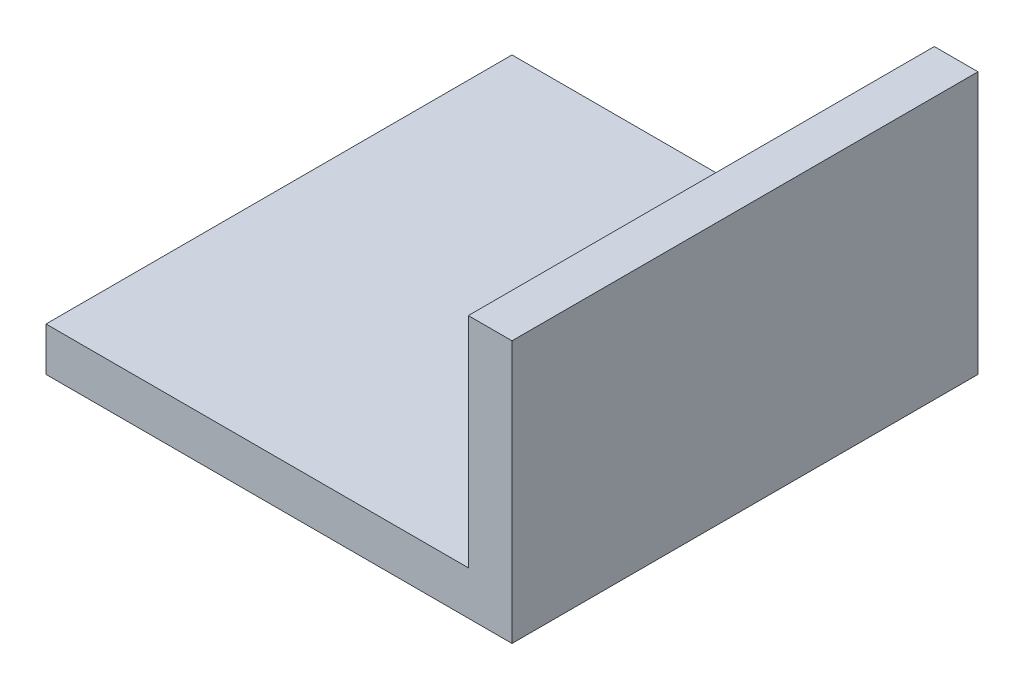
ISO-10303-21;
HEADER;
FILE_DESCRIPTION(('STEP AP214'),'2;1');
FILE_NAME('part.step','',(''),(''),'','','');
FILE_SCHEMA(('AUTOMOTIVE_DESIGN { 1 0 10303 214 1 1 1 1 }'));
ENDSEC;
DATA;
#1=APPLICATION_CONTEXT('core data for automotive mechanical design processes');
#2=APPLICATION_PROTOCOL_DEFINITION('international standard','automotive_design',2000,#1);
#3=PRODUCT_CONTEXT('',#1,'mechanical');
#4=PRODUCT('Part','Part','',(#3));
#5=PRODUCT_RELATED_PRODUCT_CATEGORY('part','',(#4));
#6=PRODUCT_DEFINITION_FORMATION('','',#4);
#7=PRODUCT_DEFINITION_CONTEXT('part definition',#1,'design');
#8=PRODUCT_DEFINITION('design','',#6,#7);
#9=PRODUCT_DEFINITION_SHAPE('','',#8);
#10=(LENGTH_UNIT() NAMED_UNIT(*) SI_UNIT(.MILLI.,.METRE.));
#11=(NAMED_UNIT(*) PLANE_ANGLE_UNIT() SI_UNIT($,.RADIAN.));
#12=(NAMED_UNIT(*) SI_UNIT($,.STERADIAN.) SOLID_ANGLE_UNIT());
#13=UNCERTAINTY_MEASURE_WITH_UNIT(LENGTH_MEASURE(1.E-05),#10,'distance_accuracy_value','');
#14=(GEOMETRIC_REPRESENTATION_CONTEXT(3) GLOBAL_UNCERTAINTY_ASSIGNED_CONTEXT((#13)) GLOBAL_UNIT_ASSIGNED_CONTEXT((#10,
#11,#12)) REPRESENTATION_CONTEXT('',''));
#15=CARTESIAN_POINT('',(0.,0.,0.));
#16=DIRECTION('',(0.,0.,1.));
#17=DIRECTION('',(1.,0.,0.));
#18=AXIS2_PLACEMENT_3D('',#15,#16,#17);
#19=CARTESIAN_POINT('',(-70.953543524342,7.11516939529826,50.8));
#20=DIRECTION('',(1.,0.,0.));
#21=DIRECTION('',(0.,0.,-1.));
#22=AXIS2_PLACEMENT_3D('',#19,#20,#21);
#23=PLANE('',#22);
#24=DIRECTION('',(0.,-1.,0.));
#25=VECTOR('',#24,1.);
#26=CARTESIAN_POINT('',(-70.953543524342,7.11516939529826,0.));
#27=LINE('',#26,#25);
#28=CARTESIAN_POINT('',(-70.953543524342,7.11516939529826,0.));
#29=VERTEX_POINT('',#28);
#30=CARTESIAN_POINT('',(-70.953543524342,2.35266939529827,0.));
#31=VERTEX_POINT('',#30);
#32=EDGE_CURVE('E127',#29,#31,#27,.T.);
#33=ORIENTED_EDGE('',*,*,#32,.T.);
#34=DIRECTION('',(0.,0.,-1.));
#35=VECTOR('',#34,1.);
#36=CARTESIAN_POINT('',(-70.953543524342,2.35266939529827,50.8));
#37=LINE('',#36,#35);
#38=CARTESIAN_POINT('',(-70.953543524342,2.35266939529827,50.8));
#39=VERTEX_POINT('',#38);
#40=EDGE_CURVE('E11',#39,#31,#37,.T.);
#41=ORIENTED_EDGE('',*,*,#40,.F.);
#42=DIRECTION('',(0.,-1.,0.));
#43=VECTOR('',#42,1.);
#44=CARTESIAN_POINT('',(-70.953543524342,7.11516939529826,50.8));
#45=LINE('',#44,#43);
#46=CARTESIAN_POINT('',(-70.953543524342,7.11516939529826,50.8));
#47=VERTEX_POINT('',#46);
#48=EDGE_CURVE('E137',#47,#39,#45,.T.);
#49=ORIENTED_EDGE('',*,*,#48,.F.);
#50=DIRECTION('',(0.,0.,-1.));
#51=VECTOR('',#50,1.);
#52=CARTESIAN_POINT('',(-70.953543524342,7.11516939529826,50.8));
#53=LINE('',#52,#51);
#54=EDGE_CURVE('E123',#47,#29,#53,.T.);
#55=ORIENTED_EDGE('',*,*,#54,.T.);
#56=EDGE_LOOP('',(#33,#41,#49,#55));
#57=FACE_BOUND('',#56,.T.);
#58=ADVANCED_FACE('F43',(#57),#23,.F.);
#59=CARTESIAN_POINT('',(-70.953543524342,2.35266939529827,50.8));
#60=DIRECTION('',(0.,1.,0.));
#61=DIRECTION('',(0.,0.,1.));
#62=AXIS2_PLACEMENT_3D('',#59,#60,#61);
#63=PLANE('',#62);
#64=DIRECTION('',(1.,0.,0.));
#65=VECTOR('',#64,1.);
#66=CARTESIAN_POINT('',(-70.953543524342,2.35266939529827,0.));
#67=LINE('',#66,#65);
#68=CARTESIAN_POINT('',(-20.153543524342,2.35266939529827,0.));
#69=VERTEX_POINT('',#68);
#70=EDGE_CURVE('E130',#31,#69,#67,.T.);
#71=ORIENTED_EDGE('',*,*,#70,.T.);
#72=DIRECTION('',(0.,0.,-1.));
#73=VECTOR('',#72,1.);
#74=CARTESIAN_POINT('',(-20.153543524342,2.35266939529827,50.8));
#75=LINE('',#74,#73);
#76=CARTESIAN_POINT('',(-20.153543524342,2.35266939529827,50.8));
#77=VERTEX_POINT('',#76);
#78=EDGE_CURVE('E51',#77,#69,#75,.T.);
#79=ORIENTED_EDGE('',*,*,#78,.F.);
#80=DIRECTION('',(1.,0.,0.));
#81=VECTOR('',#80,1.);
#82=CARTESIAN_POINT('',(-70.953543524342,2.35266939529827,50.8));
#83=LINE('',#82,#81);
#84=EDGE_CURVE('E96',#39,#77,#83,.T.);
#85=ORIENTED_EDGE('',*,*,#84,.F.);
#86=ORIENTED_EDGE('',*,*,#40,.T.);
#87=EDGE_LOOP('',(#71,#79,#85,#86));
#88=FACE_BOUND('',#87,.T.);
#89=ADVANCED_FACE('F161',(#88),#63,.F.);
#90=CARTESIAN_POINT('',(-20.153543524342,2.35266939529827,50.8));
#91=DIRECTION('',(-1.,0.,0.));
#92=DIRECTION('',(0.,0.,1.));
#93=AXIS2_PLACEMENT_3D('',#90,#91,#92);
#94=PLANE('',#93);
#95=DIRECTION('',(0.,1.,0.));
#96=VECTOR('',#95,1.);
#97=CARTESIAN_POINT('',(-20.153543524342,2.35266939529827,0.));
#98=LINE('',#97,#96);
#99=CARTESIAN_POINT('',(-20.153543524342,30.9276693952983,0.));
#100=VERTEX_POINT('',#99);
#101=EDGE_CURVE('E132',#69,#100,#98,.T.);
#102=ORIENTED_EDGE('',*,*,#101,.T.);
#103=DIRECTION('',(0.,0.,-1.));
#104=VECTOR('',#103,1.);
#105=CARTESIAN_POINT('',(-20.153543524342,30.9276693952983,50.8));
#106=LINE('',#105,#104);
#107=CARTESIAN_POINT('',(-20.153543524342,30.9276693952983,50.8));
#108=VERTEX_POINT('',#107);
#109=EDGE_CURVE('E118',#108,#100,#106,.T.);
#110=ORIENTED_EDGE('',*,*,#109,.F.);
#111=DIRECTION('',(0.,1.,0.));
#112=VECTOR('',#111,1.);
#113=CARTESIAN_POINT('',(-20.153543524342,2.35266939529827,50.8));
#114=LINE('',#113,#112);
#115=EDGE_CURVE('E109',#77,#108,#114,.T.);
#116=ORIENTED_EDGE('',*,*,#115,.F.);
#117=ORIENTED_EDGE('',*,*,#78,.T.);
#118=EDGE_LOOP('',(#102,#110,#116,#117));
#119=FACE_BOUND('',#118,.T.);
#120=ADVANCED_FACE('F143',(#119),#94,.F.);
#121=CARTESIAN_POINT('',(-20.153543524342,30.9276693952983,50.8));
#122=DIRECTION('',(0.,-1.,0.));
#123=DIRECTION('',(1.,0.,0.));
#124=AXIS2_PLACEMENT_3D('',#121,#122,#123);
#125=PLANE('',#124);
#126=DIRECTION('',(-1.,0.,0.));
#127=VECTOR('',#126,1.);
#128=CARTESIAN_POINT('',(-20.153543524342,30.9276693952983,0.));
#129=LINE('',#128,#127);
#130=CARTESIAN_POINT('',(-24.916043524342,30.9276693952983,0.));
#131=VERTEX_POINT('',#130);
#132=EDGE_CURVE('E117',#100,#131,#129,.T.);
#133=ORIENTED_EDGE('',*,*,#132,.T.);
#134=DIRECTION('',(0.,0.,-1.));
#135=VECTOR('',#134,1.);
#136=CARTESIAN_POINT('',(-24.916043524342,30.9276693952983,50.8));
#137=LINE('',#136,#135);
#138=CARTESIAN_POINT('',(-24.916043524342,30.9276693952983,50.8));
#139=VERTEX_POINT('',#138);
#140=EDGE_CURVE('E114',#139,#131,#137,.T.);
#141=ORIENTED_EDGE('',*,*,#140,.F.);
#142=DIRECTION('',(-1.,0.,0.));
#143=VECTOR('',#142,1.);
#144=CARTESIAN_POINT('',(-20.153543524342,30.9276693952983,50.8));
#145=LINE('',#144,#143);
#146=EDGE_CURVE('E103',#108,#139,#145,.T.);
#147=ORIENTED_EDGE('',*,*,#146,.F.);
#148=ORIENTED_EDGE('',*,*,#109,.T.);
#149=EDGE_LOOP('',(#133,#141,#147,#148));
#150=FACE_BOUND('',#149,.T.);
#151=ADVANCED_FACE('F115',(#150),#125,.F.);
#152=CARTESIAN_POINT('',(-24.916043524342,7.11516939529826,50.8));
#153=DIRECTION('',(1.,0.,0.));
#154=DIRECTION('',(0.,1.,0.));
#155=AXIS2_PLACEMENT_3D('',#152,#153,#154);
#156=PLANE('',#155);
#157=DIRECTION('',(0.,-1.,0.));
#158=VECTOR('',#157,1.);
#159=CARTESIAN_POINT('',(-24.916043524342,7.11516939529826,0.));
#160=LINE('',#159,#158);
#161=CARTESIAN_POINT('',(-24.916043524342,7.11516939529826,0.));
#162=VERTEX_POINT('',#161);
#163=EDGE_CURVE('E82',#131,#162,#160,.T.);
#164=ORIENTED_EDGE('',*,*,#163,.T.);
#165=DIRECTION('',(0.,0.,-1.));
#166=VECTOR('',#165,1.);
#167=CARTESIAN_POINT('',(-24.916043524342,7.11516939529826,50.8));
#168=LINE('',#167,#166);
#169=CARTESIAN_POINT('',(-24.916043524342,7.11516939529826,50.8));
#170=VERTEX_POINT('',#169);
#171=EDGE_CURVE('E119',#170,#162,#168,.T.);
#172=ORIENTED_EDGE('',*,*,#171,.F.);
#173=DIRECTION('',(0.,-1.,0.));
#174=VECTOR('',#173,1.);
#175=CARTESIAN_POINT('',(-24.916043524342,7.11516939529826,50.8));
#176=LINE('',#175,#174);
#177=EDGE_CURVE('E107',#139,#170,#176,.T.);
#178=ORIENTED_EDGE('',*,*,#177,.F.);
#179=ORIENTED_EDGE('',*,*,#140,.T.);
#180=EDGE_LOOP('',(#164,#172,#178,#179));
#181=FACE_BOUND('',#180,.T.);
#182=ADVANCED_FACE('F121',(#181),#156,.F.);
#183=CARTESIAN_POINT('',(-70.953543524342,7.11516939529826,50.8));
#184=DIRECTION('',(0.,-1.,0.));
#185=DIRECTION('',(1.,0.,0.));
#186=AXIS2_PLACEMENT_3D('',#183,#184,#185);
#187=PLANE('',#186);
#188=DIRECTION('',(-1.,0.,0.));
#189=VECTOR('',#188,1.);
#190=CARTESIAN_POINT('',(-70.953543524342,7.11516939529826,0.));
#191=LINE('',#190,#189);
#192=EDGE_CURVE('E88',#162,#29,#191,.T.);
#193=ORIENTED_EDGE('',*,*,#192,.T.);
#194=ORIENTED_EDGE('',*,*,#54,.F.);
#195=DIRECTION('',(-1.,0.,0.));
#196=VECTOR('',#195,1.);
#197=CARTESIAN_POINT('',(-70.953543524342,7.11516939529826,50.8));
#198=LINE('',#197,#196);
#199=EDGE_CURVE('E59',#170,#47,#198,.T.);
#200=ORIENTED_EDGE('',*,*,#199,.F.);
#201=ORIENTED_EDGE('',*,*,#171,.T.);
#202=EDGE_LOOP('',(#193,#194,#200,#201));
#203=FACE_BOUND('',#202,.T.);
#204=ADVANCED_FACE('F150',(#203),#187,.F.);
#205=CARTESIAN_POINT('',(0.,0.,50.8));
#206=DIRECTION('',(0.,0.,1.));
#207=DIRECTION('',(1.,0.,0.));
#208=AXIS2_PLACEMENT_3D('',#205,#206,#207);
#209=PLANE('',#208);
#210=ORIENTED_EDGE('',*,*,#48,.T.);
#211=ORIENTED_EDGE('',*,*,#84,.T.);
#212=ORIENTED_EDGE('',*,*,#115,.T.);
#213=ORIENTED_EDGE('',*,*,#146,.T.);
#214=ORIENTED_EDGE('',*,*,#177,.T.);
#215=ORIENTED_EDGE('',*,*,#199,.T.);
#216=EDGE_LOOP('',(#210,#211,#212,#213,#214,#215));
#217=FACE_BOUND('',#216,.T.);
#218=ADVANCED_FACE('F105',(#217),#209,.T.);
#219=CARTESIAN_POINT('',(0.,0.,0.));
#220=DIRECTION('',(0.,0.,1.));
#221=DIRECTION('',(1.,0.,0.));
#222=AXIS2_PLACEMENT_3D('',#219,#220,#221);
#223=PLANE('',#222);
#224=ORIENTED_EDGE('',*,*,#32,.F.);
#225=ORIENTED_EDGE('',*,*,#192,.F.);
#226=ORIENTED_EDGE('',*,*,#163,.F.);
#227=ORIENTED_EDGE('',*,*,#132,.F.);
#228=ORIENTED_EDGE('',*,*,#101,.F.);
#229=ORIENTED_EDGE('',*,*,#70,.F.);
#230=EDGE_LOOP('',(#224,#225,#226,#227,#228,#229));
#231=FACE_BOUND('',#230,.T.);
#232=ADVANCED_FACE('F146',(#231),#223,.F.);
#233=CLOSED_SHELL('',(#58,#89,#120,#151,#182,#204,#218,#232));
#234=MANIFOLD_SOLID_BREP('B2',#233);
#235=ADVANCED_BREP_SHAPE_REPRESENTATION('',(#18,#234),#14);
#236=SHAPE_DEFINITION_REPRESENTATION(#9,#235);
ENDSEC;
END-ISO-10303-21;
